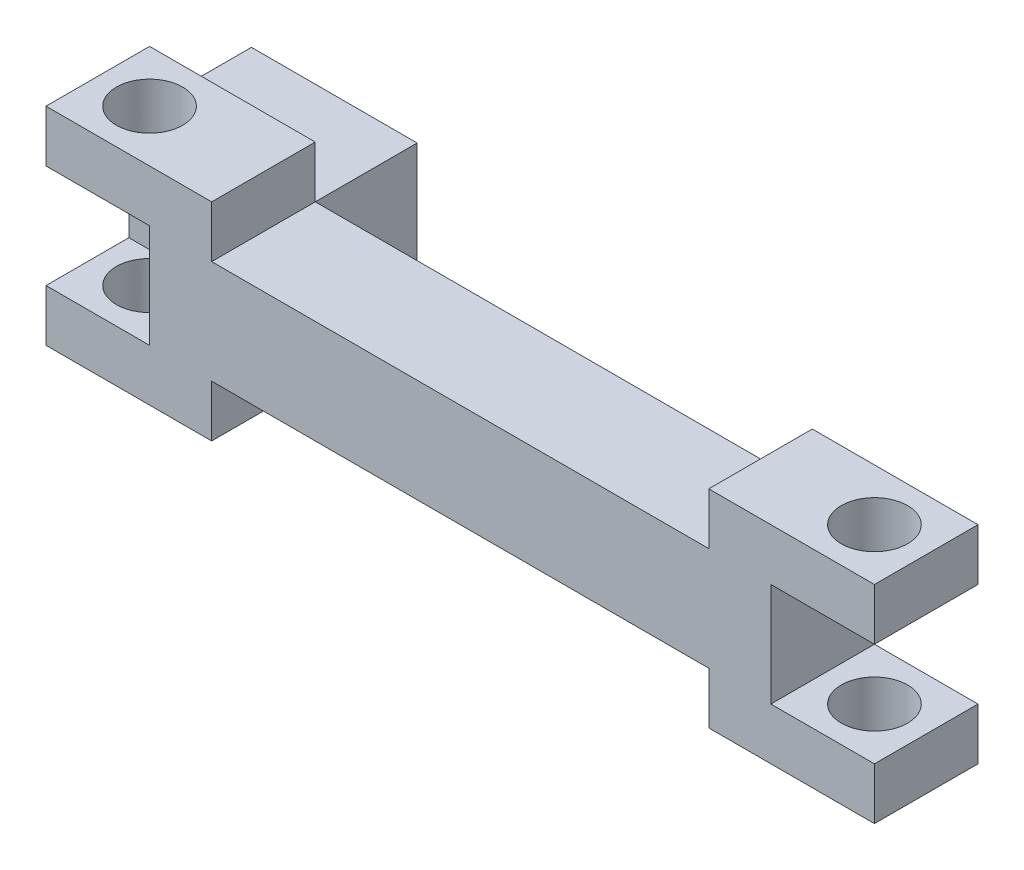
ISO-10303-21;
HEADER;
FILE_DESCRIPTION(('STEP AP214'),'2;1');
FILE_NAME('part.step','',(''),(''),'','','');
FILE_SCHEMA(('AUTOMOTIVE_DESIGN { 1 0 10303 214 1 1 1 1 }'));
ENDSEC;
DATA;
#1=APPLICATION_CONTEXT('core data for automotive mechanical design processes');
#2=APPLICATION_PROTOCOL_DEFINITION('international standard','automotive_design',2000,#1);
#3=PRODUCT_CONTEXT('',#1,'mechanical');
#4=PRODUCT('Part','Part','',(#3));
#5=PRODUCT_RELATED_PRODUCT_CATEGORY('part','',(#4));
#6=PRODUCT_DEFINITION_FORMATION('','',#4);
#7=PRODUCT_DEFINITION_CONTEXT('part definition',#1,'design');
#8=PRODUCT_DEFINITION('design','',#6,#7);
#9=PRODUCT_DEFINITION_SHAPE('','',#8);
#10=(LENGTH_UNIT() NAMED_UNIT(*) SI_UNIT(.MILLI.,.METRE.));
#11=(NAMED_UNIT(*) PLANE_ANGLE_UNIT() SI_UNIT($,.RADIAN.));
#12=(NAMED_UNIT(*) SI_UNIT($,.STERADIAN.) SOLID_ANGLE_UNIT());
#13=UNCERTAINTY_MEASURE_WITH_UNIT(LENGTH_MEASURE(1.E-05),#10,'distance_accuracy_value','');
#14=(GEOMETRIC_REPRESENTATION_CONTEXT(3) GLOBAL_UNCERTAINTY_ASSIGNED_CONTEXT((#13)) GLOBAL_UNIT_ASSIGNED_CONTEXT((#10,
#11,#12)) REPRESENTATION_CONTEXT('',''));
#15=CARTESIAN_POINT('',(0.,0.,0.));
#16=DIRECTION('',(0.,0.,1.));
#17=DIRECTION('',(1.,0.,0.));
#18=AXIS2_PLACEMENT_3D('',#15,#16,#17);
#19=CARTESIAN_POINT('',(-88.3,-13.,12.5));
#20=DIRECTION('',(0.,1.,0.));
#21=DIRECTION('',(-1.,0.,0.));
#22=AXIS2_PLACEMENT_3D('',#19,#20,#21);
#23=CYLINDRICAL_SURFACE('',#22,8.00000000000001);
#24=CARTESIAN_POINT('',(-88.3,7.5,12.5));
#25=DIRECTION('',(0.,1.,0.));
#26=DIRECTION('',(0.,0.,1.));
#27=AXIS2_PLACEMENT_3D('',#24,#25,#26);
#28=CIRCLE('',#27,8.00000000000001);
#29=CARTESIAN_POINT('',(-88.3,7.5,20.5));
#30=VERTEX_POINT('',#29);
#31=EDGE_CURVE('E292',#30,#30,#28,.T.);
#32=ORIENTED_EDGE('',*,*,#31,.F.);
#33=EDGE_LOOP('',(#32));
#34=FACE_BOUND('',#33,.T.);
#35=CARTESIAN_POINT('',(-88.3,57.5,12.5));
#36=DIRECTION('',(0.,1.,0.));
#37=DIRECTION('',(-1.,0.,0.));
#38=AXIS2_PLACEMENT_3D('',#35,#36,#37);
#39=CIRCLE('',#38,8.00000000000001);
#40=CARTESIAN_POINT('',(-96.3,57.5,12.5));
#41=VERTEX_POINT('',#40);
#42=EDGE_CURVE('E289',#41,#41,#39,.T.);
#43=ORIENTED_EDGE('',*,*,#42,.T.);
#44=EDGE_LOOP('',(#43));
#45=FACE_BOUND('',#44,.T.);
#46=DIRECTION('',(0.,1.,0.));
#47=VECTOR('',#46,1.);
#48=CARTESIAN_POINT('',(-85.516117818585,-13.,5.));
#49=LINE('',#48,#47);
#50=CARTESIAN_POINT('',(-85.516117818585,45.,5.));
#51=VERTEX_POINT('',#50);
#52=CARTESIAN_POINT('',(-85.516117818585,20.,5.));
#53=VERTEX_POINT('',#52);
#54=EDGE_CURVE('E11',#51,#53,#49,.F.);
#55=ORIENTED_EDGE('',*,*,#54,.F.);
#56=CARTESIAN_POINT('',(-88.3,45.,12.5));
#57=DIRECTION('',(0.,1.,0.));
#58=DIRECTION('',(-1.,0.,0.));
#59=AXIS2_PLACEMENT_3D('',#56,#57,#58);
#60=CIRCLE('',#59,8.00000000000001);
#61=CARTESIAN_POINT('',(-91.083882181415,45.,5.));
#62=VERTEX_POINT('',#61);
#63=EDGE_CURVE('E217',#51,#62,#60,.F.);
#64=ORIENTED_EDGE('',*,*,#63,.T.);
#65=DIRECTION('',(0.,1.,0.));
#66=VECTOR('',#65,1.);
#67=CARTESIAN_POINT('',(-91.0838821814151,-13.,5.));
#68=LINE('',#67,#66);
#69=CARTESIAN_POINT('',(-91.0838821814151,20.,5.));
#70=VERTEX_POINT('',#69);
#71=EDGE_CURVE('E416',#70,#62,#68,.T.);
#72=ORIENTED_EDGE('',*,*,#71,.F.);
#73=CARTESIAN_POINT('',(-88.3,20.,12.5));
#74=DIRECTION('',(0.,-1.,0.));
#75=DIRECTION('',(1.,0.,0.));
#76=AXIS2_PLACEMENT_3D('',#73,#74,#75);
#77=CIRCLE('',#76,8.00000000000001);
#78=EDGE_CURVE('E47',#70,#53,#77,.F.);
#79=ORIENTED_EDGE('',*,*,#78,.T.);
#80=EDGE_LOOP('',(#55,#64,#72,#79));
#81=FACE_BOUND('',#80,.T.);
#82=ADVANCED_FACE('F39',(#34,#45,#81),#23,.F.);
#83=CARTESIAN_POINT('',(0.,0.,0.));
#84=DIRECTION('',(0.,0.,1.));
#85=DIRECTION('',(1.,0.,0.));
#86=AXIS2_PLACEMENT_3D('',#83,#84,#85);
#87=PLANE('',#86);
#88=DIRECTION('',(1.,0.,0.));
#89=VECTOR('',#88,1.);
#90=CARTESIAN_POINT('',(-60.8,45.,0.));
#91=LINE('',#90,#89);
#92=CARTESIAN_POINT('',(-100.8,45.,0.));
#93=VERTEX_POINT('',#92);
#94=CARTESIAN_POINT('',(-60.8,45.,0.));
#95=VERTEX_POINT('',#94);
#96=EDGE_CURVE('E254',#93,#95,#91,.T.);
#97=ORIENTED_EDGE('',*,*,#96,.F.);
#98=DIRECTION('',(0.,1.,0.));
#99=VECTOR('',#98,1.);
#100=CARTESIAN_POINT('',(-100.8,0.,0.));
#101=LINE('',#100,#99);
#102=CARTESIAN_POINT('',(-100.8,57.5,0.));
#103=VERTEX_POINT('',#102);
#104=EDGE_CURVE('E364',#93,#103,#101,.T.);
#105=ORIENTED_EDGE('',*,*,#104,.T.);
#106=DIRECTION('',(1.,0.,0.));
#107=VECTOR('',#106,1.);
#108=CARTESIAN_POINT('',(0.,57.5,0.));
#109=LINE('',#108,#107);
#110=CARTESIAN_POINT('',(-60.8,57.5,0.));
#111=VERTEX_POINT('',#110);
#112=EDGE_CURVE('E361',#103,#111,#109,.T.);
#113=ORIENTED_EDGE('',*,*,#112,.T.);
#114=DIRECTION('',(0.,1.,0.));
#115=VECTOR('',#114,1.);
#116=CARTESIAN_POINT('',(-60.8,0.,0.));
#117=LINE('',#116,#115);
#118=EDGE_CURVE('E358',#95,#111,#117,.T.);
#119=ORIENTED_EDGE('',*,*,#118,.F.);
#120=EDGE_LOOP('',(#97,#105,#113,#119));
#121=FACE_BOUND('',#120,.T.);
#122=ADVANCED_FACE('F449',(#121),#87,.F.);
#123=DIRECTION('',(0.,-1.,0.));
#124=VECTOR('',#123,1.);
#125=CARTESIAN_POINT('',(-60.8,45.,0.));
#126=LINE('',#125,#124);
#127=CARTESIAN_POINT('',(-60.8,20.,0.));
#128=VERTEX_POINT('',#127);
#129=EDGE_CURVE('E247',#95,#128,#126,.T.);
#130=ORIENTED_EDGE('',*,*,#129,.F.);
#131=DIRECTION('',(1.,0.,0.));
#132=VECTOR('',#131,1.);
#133=CARTESIAN_POINT('',(0.,45.,0.));
#134=LINE('',#133,#132);
#135=CARTESIAN_POINT('',(59.2,45.,0.));
#136=VERTEX_POINT('',#135);
#137=EDGE_CURVE('E355',#95,#136,#134,.T.);
#138=ORIENTED_EDGE('',*,*,#137,.T.);
#139=DIRECTION('',(0.,-1.,0.));
#140=VECTOR('',#139,1.);
#141=CARTESIAN_POINT('',(59.2,0.,0.));
#142=LINE('',#141,#140);
#143=CARTESIAN_POINT('',(59.2,57.5,0.));
#144=VERTEX_POINT('',#143);
#145=EDGE_CURVE('E352',#144,#136,#142,.T.);
#146=ORIENTED_EDGE('',*,*,#145,.F.);
#147=DIRECTION('',(1.,0.,0.));
#148=VECTOR('',#147,1.);
#149=CARTESIAN_POINT('',(0.,57.5,0.));
#150=LINE('',#149,#148);
#151=CARTESIAN_POINT('',(99.2,57.5,0.));
#152=VERTEX_POINT('',#151);
#153=EDGE_CURVE('E349',#144,#152,#150,.T.);
#154=ORIENTED_EDGE('',*,*,#153,.T.);
#155=DIRECTION('',(0.,-1.,0.));
#156=VECTOR('',#155,1.);
#157=CARTESIAN_POINT('',(99.2,0.,0.));
#158=LINE('',#157,#156);
#159=CARTESIAN_POINT('',(99.2,45.,0.));
#160=VERTEX_POINT('',#159);
#161=EDGE_CURVE('E346',#152,#160,#158,.T.);
#162=ORIENTED_EDGE('',*,*,#161,.T.);
#163=DIRECTION('',(1.,0.,0.));
#164=VECTOR('',#163,1.);
#165=CARTESIAN_POINT('',(0.,45.,0.));
#166=LINE('',#165,#164);
#167=CARTESIAN_POINT('',(74.2,45.,0.));
#168=VERTEX_POINT('',#167);
#169=EDGE_CURVE('E343',#168,#160,#166,.T.);
#170=ORIENTED_EDGE('',*,*,#169,.F.);
#171=DIRECTION('',(0.,1.,0.));
#172=VECTOR('',#171,1.);
#173=CARTESIAN_POINT('',(74.2,0.,0.));
#174=LINE('',#173,#172);
#175=CARTESIAN_POINT('',(74.2,20.,0.));
#176=VERTEX_POINT('',#175);
#177=EDGE_CURVE('E341',#176,#168,#174,.T.);
#178=ORIENTED_EDGE('',*,*,#177,.F.);
#179=DIRECTION('',(1.,0.,0.));
#180=VECTOR('',#179,1.);
#181=CARTESIAN_POINT('',(0.,20.,0.));
#182=LINE('',#181,#180);
#183=CARTESIAN_POINT('',(99.2,20.,0.));
#184=VERTEX_POINT('',#183);
#185=EDGE_CURVE('E338',#176,#184,#182,.T.);
#186=ORIENTED_EDGE('',*,*,#185,.T.);
#187=DIRECTION('',(0.,-1.,0.));
#188=VECTOR('',#187,1.);
#189=CARTESIAN_POINT('',(99.2,0.,0.));
#190=LINE('',#189,#188);
#191=CARTESIAN_POINT('',(99.2,7.5,0.));
#192=VERTEX_POINT('',#191);
#193=EDGE_CURVE('E335',#184,#192,#190,.T.);
#194=ORIENTED_EDGE('',*,*,#193,.T.);
#195=DIRECTION('',(1.,0.,0.));
#196=VECTOR('',#195,1.);
#197=CARTESIAN_POINT('',(0.,7.5,0.));
#198=LINE('',#197,#196);
#199=CARTESIAN_POINT('',(59.2,7.5,0.));
#200=VERTEX_POINT('',#199);
#201=EDGE_CURVE('E297',#200,#192,#198,.T.);
#202=ORIENTED_EDGE('',*,*,#201,.F.);
#203=DIRECTION('',(0.,-1.,0.));
#204=VECTOR('',#203,1.);
#205=CARTESIAN_POINT('',(59.2,0.,0.));
#206=LINE('',#205,#204);
#207=CARTESIAN_POINT('',(59.2,20.,0.));
#208=VERTEX_POINT('',#207);
#209=EDGE_CURVE('E374',#208,#200,#206,.T.);
#210=ORIENTED_EDGE('',*,*,#209,.F.);
#211=DIRECTION('',(1.,0.,0.));
#212=VECTOR('',#211,1.);
#213=CARTESIAN_POINT('',(0.,20.,0.));
#214=LINE('',#213,#212);
#215=EDGE_CURVE('E372',#128,#208,#214,.T.);
#216=ORIENTED_EDGE('',*,*,#215,.F.);
#217=EDGE_LOOP('',(#130,#138,#146,#154,#162,#170,#178,#186,#194,#202,#210,#216));
#218=FACE_BOUND('',#217,.T.);
#219=ADVANCED_FACE('F455',(#218),#87,.F.);
#220=DIRECTION('',(-1.,0.,0.));
#221=VECTOR('',#220,1.);
#222=CARTESIAN_POINT('',(-60.8,20.,0.));
#223=LINE('',#222,#221);
#224=CARTESIAN_POINT('',(-100.8,20.,0.));
#225=VERTEX_POINT('',#224);
#226=EDGE_CURVE('E263',#128,#225,#223,.T.);
#227=ORIENTED_EDGE('',*,*,#226,.F.);
#228=DIRECTION('',(0.,1.,0.));
#229=VECTOR('',#228,1.);
#230=CARTESIAN_POINT('',(-60.8,0.,0.));
#231=LINE('',#230,#229);
#232=CARTESIAN_POINT('',(-60.8,7.5,0.));
#233=VERTEX_POINT('',#232);
#234=EDGE_CURVE('E369',#233,#128,#231,.T.);
#235=ORIENTED_EDGE('',*,*,#234,.F.);
#236=DIRECTION('',(1.,0.,0.));
#237=VECTOR('',#236,1.);
#238=CARTESIAN_POINT('',(0.,7.5,0.));
#239=LINE('',#238,#237);
#240=CARTESIAN_POINT('',(-100.8,7.5,0.));
#241=VERTEX_POINT('',#240);
#242=EDGE_CURVE('E367',#241,#233,#239,.T.);
#243=ORIENTED_EDGE('',*,*,#242,.F.);
#244=EDGE_CURVE('E365',#241,#225,#101,.T.);
#245=ORIENTED_EDGE('',*,*,#244,.T.);
#246=EDGE_LOOP('',(#227,#235,#243,#245));
#247=FACE_BOUND('',#246,.T.);
#248=ADVANCED_FACE('F458',(#247),#87,.F.);
#249=CARTESIAN_POINT('',(99.2,0.,25.));
#250=DIRECTION('',(1.,0.,0.));
#251=DIRECTION('',(0.,0.,-1.));
#252=AXIS2_PLACEMENT_3D('',#249,#250,#251);
#253=PLANE('',#252);
#254=ORIENTED_EDGE('',*,*,#193,.F.);
#255=DIRECTION('',(0.,0.,-1.));
#256=VECTOR('',#255,1.);
#257=CARTESIAN_POINT('',(99.2,20.,25.));
#258=LINE('',#257,#256);
#259=CARTESIAN_POINT('',(99.2,20.,25.));
#260=VERTEX_POINT('',#259);
#261=EDGE_CURVE('E414',#260,#184,#258,.T.);
#262=ORIENTED_EDGE('',*,*,#261,.F.);
#263=DIRECTION('',(0.,-1.,0.));
#264=VECTOR('',#263,1.);
#265=CARTESIAN_POINT('',(99.2,0.,25.));
#266=LINE('',#265,#264);
#267=CARTESIAN_POINT('',(99.2,7.5,25.));
#268=VERTEX_POINT('',#267);
#269=EDGE_CURVE('E293',#260,#268,#266,.T.);
#270=ORIENTED_EDGE('',*,*,#269,.T.);
#271=DIRECTION('',(0.,0.,-1.));
#272=VECTOR('',#271,1.);
#273=CARTESIAN_POINT('',(99.2,7.5,25.));
#274=LINE('',#273,#272);
#275=EDGE_CURVE('E334',#268,#192,#274,.T.);
#276=ORIENTED_EDGE('',*,*,#275,.T.);
#277=EDGE_LOOP('',(#254,#262,#270,#276));
#278=FACE_BOUND('',#277,.T.);
#279=ADVANCED_FACE('F41',(#278),#253,.T.);
#280=CARTESIAN_POINT('',(0.,20.,25.));
#281=DIRECTION('',(0.,1.,0.));
#282=DIRECTION('',(0.,0.,1.));
#283=AXIS2_PLACEMENT_3D('',#280,#281,#282);
#284=PLANE('',#283);
#285=CARTESIAN_POINT('',(86.7,20.,12.5));
#286=DIRECTION('',(0.,1.,0.));
#287=DIRECTION('',(0.,0.,1.));
#288=AXIS2_PLACEMENT_3D('',#285,#286,#287);
#289=CIRCLE('',#288,8.00000000000001);
#290=CARTESIAN_POINT('',(86.7,20.,20.5));
#291=VERTEX_POINT('',#290);
#292=EDGE_CURVE('E286',#291,#291,#289,.T.);
#293=ORIENTED_EDGE('',*,*,#292,.F.);
#294=EDGE_LOOP('',(#293));
#295=FACE_BOUND('',#294,.T.);
#296=ORIENTED_EDGE('',*,*,#185,.F.);
#297=DIRECTION('',(0.,0.,-1.));
#298=VECTOR('',#297,1.);
#299=CARTESIAN_POINT('',(74.2,20.,25.));
#300=LINE('',#299,#298);
#301=CARTESIAN_POINT('',(74.2,20.,25.));
#302=VERTEX_POINT('',#301);
#303=EDGE_CURVE('E412',#302,#176,#300,.T.);
#304=ORIENTED_EDGE('',*,*,#303,.F.);
#305=DIRECTION('',(1.,0.,0.));
#306=VECTOR('',#305,1.);
#307=CARTESIAN_POINT('',(0.,20.,25.));
#308=LINE('',#307,#306);
#309=EDGE_CURVE('E296',#302,#260,#308,.T.);
#310=ORIENTED_EDGE('',*,*,#309,.T.);
#311=ORIENTED_EDGE('',*,*,#261,.T.);
#312=EDGE_LOOP('',(#296,#304,#310,#311));
#313=FACE_BOUND('',#312,.T.);
#314=ADVANCED_FACE('F520',(#295,#313),#284,.T.);
#315=CARTESIAN_POINT('',(74.2,0.,25.));
#316=DIRECTION('',(-1.,0.,0.));
#317=DIRECTION('',(0.,0.,1.));
#318=AXIS2_PLACEMENT_3D('',#315,#316,#317);
#319=PLANE('',#318);
#320=ORIENTED_EDGE('',*,*,#177,.T.);
#321=DIRECTION('',(0.,0.,-1.));
#322=VECTOR('',#321,1.);
#323=CARTESIAN_POINT('',(74.2,45.,25.));
#324=LINE('',#323,#322);
#325=CARTESIAN_POINT('',(74.2,45.,25.));
#326=VERTEX_POINT('',#325);
#327=EDGE_CURVE('E409',#326,#168,#324,.T.);
#328=ORIENTED_EDGE('',*,*,#327,.F.);
#329=DIRECTION('',(0.,1.,0.));
#330=VECTOR('',#329,1.);
#331=CARTESIAN_POINT('',(74.2,0.,25.));
#332=LINE('',#331,#330);
#333=EDGE_CURVE('E300',#302,#326,#332,.T.);
#334=ORIENTED_EDGE('',*,*,#333,.F.);
#335=ORIENTED_EDGE('',*,*,#303,.T.);
#336=EDGE_LOOP('',(#320,#328,#334,#335));
#337=FACE_BOUND('',#336,.T.);
#338=ADVANCED_FACE('F517',(#337),#319,.F.);
#339=CARTESIAN_POINT('',(0.,45.,25.));
#340=DIRECTION('',(0.,1.,0.));
#341=DIRECTION('',(0.,0.,1.));
#342=AXIS2_PLACEMENT_3D('',#339,#340,#341);
#343=PLANE('',#342);
#344=CARTESIAN_POINT('',(86.7,45.,12.5));
#345=DIRECTION('',(0.,1.,0.));
#346=DIRECTION('',(0.,0.,1.));
#347=AXIS2_PLACEMENT_3D('',#344,#345,#346);
#348=CIRCLE('',#347,8.00000000000001);
#349=CARTESIAN_POINT('',(86.7,45.,20.5));
#350=VERTEX_POINT('',#349);
#351=EDGE_CURVE('E283',#350,#350,#348,.T.);
#352=ORIENTED_EDGE('',*,*,#351,.T.);
#353=EDGE_LOOP('',(#352));
#354=FACE_BOUND('',#353,.T.);
#355=ORIENTED_EDGE('',*,*,#169,.T.);
#356=DIRECTION('',(0.,0.,-1.));
#357=VECTOR('',#356,1.);
#358=CARTESIAN_POINT('',(99.2,45.,25.));
#359=LINE('',#358,#357);
#360=CARTESIAN_POINT('',(99.2,45.,25.));
#361=VERTEX_POINT('',#360);
#362=EDGE_CURVE('E407',#361,#160,#359,.T.);
#363=ORIENTED_EDGE('',*,*,#362,.F.);
#364=DIRECTION('',(1.,0.,0.));
#365=VECTOR('',#364,1.);
#366=CARTESIAN_POINT('',(0.,45.,25.));
#367=LINE('',#366,#365);
#368=EDGE_CURVE('E302',#326,#361,#367,.T.);
#369=ORIENTED_EDGE('',*,*,#368,.F.);
#370=ORIENTED_EDGE('',*,*,#327,.T.);
#371=EDGE_LOOP('',(#355,#363,#369,#370));
#372=FACE_BOUND('',#371,.T.);
#373=ADVANCED_FACE('F513',(#354,#372),#343,.F.);
#374=CARTESIAN_POINT('',(99.2,0.,25.));
#375=DIRECTION('',(1.,0.,0.));
#376=DIRECTION('',(0.,0.,-1.));
#377=AXIS2_PLACEMENT_3D('',#374,#375,#376);
#378=PLANE('',#377);
#379=ORIENTED_EDGE('',*,*,#161,.F.);
#380=DIRECTION('',(0.,0.,-1.));
#381=VECTOR('',#380,1.);
#382=CARTESIAN_POINT('',(99.2,57.5,25.));
#383=LINE('',#382,#381);
#384=CARTESIAN_POINT('',(99.2,57.5,25.));
#385=VERTEX_POINT('',#384);
#386=EDGE_CURVE('E405',#385,#152,#383,.T.);
#387=ORIENTED_EDGE('',*,*,#386,.F.);
#388=DIRECTION('',(0.,-1.,0.));
#389=VECTOR('',#388,1.);
#390=CARTESIAN_POINT('',(99.2,0.,25.));
#391=LINE('',#390,#389);
#392=EDGE_CURVE('E304',#385,#361,#391,.T.);
#393=ORIENTED_EDGE('',*,*,#392,.T.);
#394=ORIENTED_EDGE('',*,*,#362,.T.);
#395=EDGE_LOOP('',(#379,#387,#393,#394));
#396=FACE_BOUND('',#395,.T.);
#397=ADVANCED_FACE('F509',(#396),#378,.T.);
#398=CARTESIAN_POINT('',(0.,57.5,25.));
#399=DIRECTION('',(0.,1.,0.));
#400=DIRECTION('',(-1.,0.,0.));
#401=AXIS2_PLACEMENT_3D('',#398,#399,#400);
#402=PLANE('',#401);
#403=CARTESIAN_POINT('',(86.7,57.5,12.5));
#404=DIRECTION('',(0.,1.,0.));
#405=DIRECTION('',(-1.,0.,0.));
#406=AXIS2_PLACEMENT_3D('',#403,#404,#405);
#407=CIRCLE('',#406,8.00000000000001);
#408=CARTESIAN_POINT('',(78.7,57.5,12.5));
#409=VERTEX_POINT('',#408);
#410=EDGE_CURVE('E279',#409,#409,#407,.T.);
#411=ORIENTED_EDGE('',*,*,#410,.F.);
#412=EDGE_LOOP('',(#411));
#413=FACE_BOUND('',#412,.T.);
#414=ORIENTED_EDGE('',*,*,#153,.F.);
#415=DIRECTION('',(0.,0.,-1.));
#416=VECTOR('',#415,1.);
#417=CARTESIAN_POINT('',(59.2,57.5,25.));
#418=LINE('',#417,#416);
#419=CARTESIAN_POINT('',(59.2,57.5,25.));
#420=VERTEX_POINT('',#419);
#421=EDGE_CURVE('E403',#420,#144,#418,.T.);
#422=ORIENTED_EDGE('',*,*,#421,.F.);
#423=DIRECTION('',(1.,0.,0.));
#424=VECTOR('',#423,1.);
#425=CARTESIAN_POINT('',(0.,57.5,25.));
#426=LINE('',#425,#424);
#427=EDGE_CURVE('E307',#420,#385,#426,.T.);
#428=ORIENTED_EDGE('',*,*,#427,.T.);
#429=ORIENTED_EDGE('',*,*,#386,.T.);
#430=EDGE_LOOP('',(#414,#422,#428,#429));
#431=FACE_BOUND('',#430,.T.);
#432=ADVANCED_FACE('F505',(#413,#431),#402,.T.);
#433=CARTESIAN_POINT('',(59.2,0.,25.));
#434=DIRECTION('',(1.,0.,0.));
#435=DIRECTION('',(0.,0.,-1.));
#436=AXIS2_PLACEMENT_3D('',#433,#434,#435);
#437=PLANE('',#436);
#438=ORIENTED_EDGE('',*,*,#145,.T.);
#439=DIRECTION('',(0.,0.,-1.));
#440=VECTOR('',#439,1.);
#441=CARTESIAN_POINT('',(59.2,45.,25.));
#442=LINE('',#441,#440);
#443=CARTESIAN_POINT('',(59.2,45.,25.));
#444=VERTEX_POINT('',#443);
#445=EDGE_CURVE('E401',#444,#136,#442,.T.);
#446=ORIENTED_EDGE('',*,*,#445,.F.);
#447=DIRECTION('',(0.,-1.,0.));
#448=VECTOR('',#447,1.);
#449=CARTESIAN_POINT('',(59.2,0.,25.));
#450=LINE('',#449,#448);
#451=EDGE_CURVE('E310',#420,#444,#450,.T.);
#452=ORIENTED_EDGE('',*,*,#451,.F.);
#453=ORIENTED_EDGE('',*,*,#421,.T.);
#454=EDGE_LOOP('',(#438,#446,#452,#453));
#455=FACE_BOUND('',#454,.T.);
#456=ADVANCED_FACE('F501',(#455),#437,.F.);
#457=CARTESIAN_POINT('',(0.,45.,25.));
#458=DIRECTION('',(0.,1.,0.));
#459=DIRECTION('',(0.,0.,1.));
#460=AXIS2_PLACEMENT_3D('',#457,#458,#459);
#461=PLANE('',#460);
#462=ORIENTED_EDGE('',*,*,#137,.F.);
#463=DIRECTION('',(0.,0.,-1.));
#464=VECTOR('',#463,1.);
#465=CARTESIAN_POINT('',(-60.8,45.,25.));
#466=LINE('',#465,#464);
#467=CARTESIAN_POINT('',(-60.8,45.,25.));
#468=VERTEX_POINT('',#467);
#469=EDGE_CURVE('E398',#468,#95,#466,.T.);
#470=ORIENTED_EDGE('',*,*,#469,.F.);
#471=DIRECTION('',(1.,0.,0.));
#472=VECTOR('',#471,1.);
#473=CARTESIAN_POINT('',(0.,45.,25.));
#474=LINE('',#473,#472);
#475=EDGE_CURVE('E312',#468,#444,#474,.T.);
#476=ORIENTED_EDGE('',*,*,#475,.T.);
#477=ORIENTED_EDGE('',*,*,#445,.T.);
#478=EDGE_LOOP('',(#462,#470,#476,#477));
#479=FACE_BOUND('',#478,.T.);
#480=ADVANCED_FACE('F497',(#479),#461,.T.);
#481=CARTESIAN_POINT('',(-60.8,0.,25.));
#482=DIRECTION('',(-1.,0.,0.));
#483=DIRECTION('',(0.,0.,1.));
#484=AXIS2_PLACEMENT_3D('',#481,#482,#483);
#485=PLANE('',#484);
#486=ORIENTED_EDGE('',*,*,#118,.T.);
#487=DIRECTION('',(0.,0.,-1.));
#488=VECTOR('',#487,1.);
#489=CARTESIAN_POINT('',(-60.8,57.5,25.));
#490=LINE('',#489,#488);
#491=CARTESIAN_POINT('',(-60.8,57.5,25.));
#492=VERTEX_POINT('',#491);
#493=EDGE_CURVE('E396',#492,#111,#490,.T.);
#494=ORIENTED_EDGE('',*,*,#493,.F.);
#495=DIRECTION('',(0.,1.,0.));
#496=VECTOR('',#495,1.);
#497=CARTESIAN_POINT('',(-60.8,0.,25.));
#498=LINE('',#497,#496);
#499=EDGE_CURVE('E315',#468,#492,#498,.T.);
#500=ORIENTED_EDGE('',*,*,#499,.F.);
#501=ORIENTED_EDGE('',*,*,#469,.T.);
#502=EDGE_LOOP('',(#486,#494,#500,#501));
#503=FACE_BOUND('',#502,.T.);
#504=ADVANCED_FACE('F493',(#503),#485,.F.);
#505=CARTESIAN_POINT('',(0.,57.5,25.));
#506=DIRECTION('',(0.,1.,0.));
#507=DIRECTION('',(-1.,0.,0.));
#508=AXIS2_PLACEMENT_3D('',#505,#506,#507);
#509=PLANE('',#508);
#510=ORIENTED_EDGE('',*,*,#42,.F.);
#511=EDGE_LOOP('',(#510));
#512=FACE_BOUND('',#511,.T.);
#513=ORIENTED_EDGE('',*,*,#112,.F.);
#514=DIRECTION('',(0.,0.,-1.));
#515=VECTOR('',#514,1.);
#516=CARTESIAN_POINT('',(-100.8,57.5,25.));
#517=LINE('',#516,#515);
#518=CARTESIAN_POINT('',(-100.8,57.5,25.));
#519=VERTEX_POINT('',#518);
#520=EDGE_CURVE('E393',#519,#103,#517,.T.);
#521=ORIENTED_EDGE('',*,*,#520,.F.);
#522=DIRECTION('',(1.,0.,0.));
#523=VECTOR('',#522,1.);
#524=CARTESIAN_POINT('',(0.,57.5,25.));
#525=LINE('',#524,#523);
#526=EDGE_CURVE('E317',#519,#492,#525,.T.);
#527=ORIENTED_EDGE('',*,*,#526,.T.);
#528=ORIENTED_EDGE('',*,*,#493,.T.);
#529=EDGE_LOOP('',(#513,#521,#527,#528));
#530=FACE_BOUND('',#529,.T.);
#531=ADVANCED_FACE('F490',(#512,#530),#509,.T.);
#532=CARTESIAN_POINT('',(-100.8,0.,25.));
#533=DIRECTION('',(-1.,0.,0.));
#534=DIRECTION('',(0.,0.,1.));
#535=AXIS2_PLACEMENT_3D('',#532,#533,#534);
#536=PLANE('',#535);
#537=DIRECTION('',(0.,0.,1.));
#538=VECTOR('',#537,1.);
#539=CARTESIAN_POINT('',(-100.8,20.,5.));
#540=LINE('',#539,#538);
#541=CARTESIAN_POINT('',(-100.8,20.,5.));
#542=VERTEX_POINT('',#541);
#543=CARTESIAN_POINT('',(-100.8,20.,25.));
#544=VERTEX_POINT('',#543);
#545=EDGE_CURVE('E240',#542,#544,#540,.T.);
#546=ORIENTED_EDGE('',*,*,#545,.F.);
#547=DIRECTION('',(0.,-1.,0.));
#548=VECTOR('',#547,1.);
#549=CARTESIAN_POINT('',(-100.8,20.,5.));
#550=LINE('',#549,#548);
#551=CARTESIAN_POINT('',(-100.8,45.,5.));
#552=VERTEX_POINT('',#551);
#553=EDGE_CURVE('E220',#552,#542,#550,.T.);
#554=ORIENTED_EDGE('',*,*,#553,.F.);
#555=DIRECTION('',(0.,0.,1.));
#556=VECTOR('',#555,1.);
#557=CARTESIAN_POINT('',(-100.8,45.,5.));
#558=LINE('',#557,#556);
#559=CARTESIAN_POINT('',(-100.8,45.,25.));
#560=VERTEX_POINT('',#559);
#561=EDGE_CURVE('E210',#552,#560,#558,.T.);
#562=ORIENTED_EDGE('',*,*,#561,.T.);
#563=DIRECTION('',(0.,1.,0.));
#564=VECTOR('',#563,1.);
#565=CARTESIAN_POINT('',(-100.8,0.,25.));
#566=LINE('',#565,#564);
#567=EDGE_CURVE('E320',#560,#519,#566,.T.);
#568=ORIENTED_EDGE('',*,*,#567,.T.);
#569=ORIENTED_EDGE('',*,*,#520,.T.);
#570=ORIENTED_EDGE('',*,*,#104,.F.);
#571=DIRECTION('',(0.,0.,1.));
#572=VECTOR('',#571,1.);
#573=CARTESIAN_POINT('',(-100.8,45.,-24.6));
#574=LINE('',#573,#572);
#575=CARTESIAN_POINT('',(-100.8,45.,-24.6));
#576=VERTEX_POINT('',#575);
#577=EDGE_CURVE('E270',#576,#93,#574,.T.);
#578=ORIENTED_EDGE('',*,*,#577,.F.);
#579=DIRECTION('',(0.,1.,0.));
#580=VECTOR('',#579,1.);
#581=CARTESIAN_POINT('',(-100.8,45.,-24.6));
#582=LINE('',#581,#580);
#583=CARTESIAN_POINT('',(-100.8,20.,-24.6));
#584=VERTEX_POINT('',#583);
#585=EDGE_CURVE('E256',#584,#576,#582,.T.);
#586=ORIENTED_EDGE('',*,*,#585,.F.);
#587=DIRECTION('',(0.,0.,1.));
#588=VECTOR('',#587,1.);
#589=CARTESIAN_POINT('',(-100.8,20.,-24.6));
#590=LINE('',#589,#588);
#591=EDGE_CURVE('E273',#584,#225,#590,.T.);
#592=ORIENTED_EDGE('',*,*,#591,.T.);
#593=ORIENTED_EDGE('',*,*,#244,.F.);
#594=DIRECTION('',(0.,0.,-1.));
#595=VECTOR('',#594,1.);
#596=CARTESIAN_POINT('',(-100.8,7.5,25.));
#597=LINE('',#596,#595);
#598=CARTESIAN_POINT('',(-100.8,7.5,25.));
#599=VERTEX_POINT('',#598);
#600=EDGE_CURVE('E391',#599,#241,#597,.T.);
#601=ORIENTED_EDGE('',*,*,#600,.F.);
#602=EDGE_CURVE('E321',#599,#544,#566,.T.);
#603=ORIENTED_EDGE('',*,*,#602,.T.);
#604=EDGE_LOOP('',(#546,#554,#562,#568,#569,#570,#578,#586,#592,#593,#601,#603));
#605=FACE_BOUND('',#604,.T.);
#606=ADVANCED_FACE('F437',(#605),#536,.T.);
#607=CARTESIAN_POINT('',(0.,7.5,25.));
#608=DIRECTION('',(0.,1.,0.));
#609=DIRECTION('',(0.,0.,1.));
#610=AXIS2_PLACEMENT_3D('',#607,#608,#609);
#611=PLANE('',#610);
#612=ORIENTED_EDGE('',*,*,#31,.T.);
#613=EDGE_LOOP('',(#612));
#614=FACE_BOUND('',#613,.T.);
#615=ORIENTED_EDGE('',*,*,#242,.T.);
#616=DIRECTION('',(0.,0.,-1.));
#617=VECTOR('',#616,1.);
#618=CARTESIAN_POINT('',(-60.8,7.5,25.));
#619=LINE('',#618,#617);
#620=CARTESIAN_POINT('',(-60.8,7.5,25.));
#621=VERTEX_POINT('',#620);
#622=EDGE_CURVE('E388',#621,#233,#619,.T.);
#623=ORIENTED_EDGE('',*,*,#622,.F.);
#624=DIRECTION('',(1.,0.,0.));
#625=VECTOR('',#624,1.);
#626=CARTESIAN_POINT('',(0.,7.5,25.));
#627=LINE('',#626,#625);
#628=EDGE_CURVE('E324',#599,#621,#627,.T.);
#629=ORIENTED_EDGE('',*,*,#628,.F.);
#630=ORIENTED_EDGE('',*,*,#600,.T.);
#631=EDGE_LOOP('',(#615,#623,#629,#630));
#632=FACE_BOUND('',#631,.T.);
#633=ADVANCED_FACE('F483',(#614,#632),#611,.F.);
#634=CARTESIAN_POINT('',(-60.8,0.,25.));
#635=DIRECTION('',(-1.,0.,0.));
#636=DIRECTION('',(0.,0.,1.));
#637=AXIS2_PLACEMENT_3D('',#634,#635,#636);
#638=PLANE('',#637);
#639=ORIENTED_EDGE('',*,*,#234,.T.);
#640=DIRECTION('',(0.,0.,-1.));
#641=VECTOR('',#640,1.);
#642=CARTESIAN_POINT('',(-60.8,20.,25.));
#643=LINE('',#642,#641);
#644=CARTESIAN_POINT('',(-60.8,20.,25.));
#645=VERTEX_POINT('',#644);
#646=EDGE_CURVE('E385',#645,#128,#643,.T.);
#647=ORIENTED_EDGE('',*,*,#646,.F.);
#648=DIRECTION('',(0.,1.,0.));
#649=VECTOR('',#648,1.);
#650=CARTESIAN_POINT('',(-60.8,0.,25.));
#651=LINE('',#650,#649);
#652=EDGE_CURVE('E326',#621,#645,#651,.T.);
#653=ORIENTED_EDGE('',*,*,#652,.F.);
#654=ORIENTED_EDGE('',*,*,#622,.T.);
#655=EDGE_LOOP('',(#639,#647,#653,#654));
#656=FACE_BOUND('',#655,.T.);
#657=ADVANCED_FACE('F479',(#656),#638,.F.);
#658=CARTESIAN_POINT('',(0.,20.,25.));
#659=DIRECTION('',(0.,1.,0.));
#660=DIRECTION('',(0.,0.,1.));
#661=AXIS2_PLACEMENT_3D('',#658,#659,#660);
#662=PLANE('',#661);
#663=ORIENTED_EDGE('',*,*,#215,.T.);
#664=DIRECTION('',(0.,0.,-1.));
#665=VECTOR('',#664,1.);
#666=CARTESIAN_POINT('',(59.2,20.,25.));
#667=LINE('',#666,#665);
#668=CARTESIAN_POINT('',(59.2,20.,25.));
#669=VERTEX_POINT('',#668);
#670=EDGE_CURVE('E382',#669,#208,#667,.T.);
#671=ORIENTED_EDGE('',*,*,#670,.F.);
#672=DIRECTION('',(1.,0.,0.));
#673=VECTOR('',#672,1.);
#674=CARTESIAN_POINT('',(0.,20.,25.));
#675=LINE('',#674,#673);
#676=EDGE_CURVE('E328',#645,#669,#675,.T.);
#677=ORIENTED_EDGE('',*,*,#676,.F.);
#678=ORIENTED_EDGE('',*,*,#646,.T.);
#679=EDGE_LOOP('',(#663,#671,#677,#678));
#680=FACE_BOUND('',#679,.T.);
#681=ADVANCED_FACE('F475',(#680),#662,.F.);
#682=CARTESIAN_POINT('',(59.2,0.,25.));
#683=DIRECTION('',(1.,0.,0.));
#684=DIRECTION('',(0.,0.,-1.));
#685=AXIS2_PLACEMENT_3D('',#682,#683,#684);
#686=PLANE('',#685);
#687=ORIENTED_EDGE('',*,*,#209,.T.);
#688=DIRECTION('',(0.,0.,-1.));
#689=VECTOR('',#688,1.);
#690=CARTESIAN_POINT('',(59.2,7.5,25.));
#691=LINE('',#690,#689);
#692=CARTESIAN_POINT('',(59.2,7.5,25.));
#693=VERTEX_POINT('',#692);
#694=EDGE_CURVE('E379',#693,#200,#691,.T.);
#695=ORIENTED_EDGE('',*,*,#694,.F.);
#696=DIRECTION('',(0.,-1.,0.));
#697=VECTOR('',#696,1.);
#698=CARTESIAN_POINT('',(59.2,0.,25.));
#699=LINE('',#698,#697);
#700=EDGE_CURVE('E330',#669,#693,#699,.T.);
#701=ORIENTED_EDGE('',*,*,#700,.F.);
#702=ORIENTED_EDGE('',*,*,#670,.T.);
#703=EDGE_LOOP('',(#687,#695,#701,#702));
#704=FACE_BOUND('',#703,.T.);
#705=ADVANCED_FACE('F471',(#704),#686,.F.);
#706=CARTESIAN_POINT('',(0.,7.5,25.));
#707=DIRECTION('',(0.,1.,0.));
#708=DIRECTION('',(0.,0.,1.));
#709=AXIS2_PLACEMENT_3D('',#706,#707,#708);
#710=PLANE('',#709);
#711=CARTESIAN_POINT('',(86.7,7.5,12.5));
#712=DIRECTION('',(0.,1.,0.));
#713=DIRECTION('',(0.,0.,1.));
#714=AXIS2_PLACEMENT_3D('',#711,#712,#713);
#715=CIRCLE('',#714,8.00000000000001);
#716=CARTESIAN_POINT('',(86.7,7.5,20.5));
#717=VERTEX_POINT('',#716);
#718=EDGE_CURVE('E282',#717,#717,#715,.T.);
#719=ORIENTED_EDGE('',*,*,#718,.T.);
#720=EDGE_LOOP('',(#719));
#721=FACE_BOUND('',#720,.T.);
#722=ORIENTED_EDGE('',*,*,#201,.T.);
#723=ORIENTED_EDGE('',*,*,#275,.F.);
#724=DIRECTION('',(1.,0.,0.));
#725=VECTOR('',#724,1.);
#726=CARTESIAN_POINT('',(0.,7.5,25.));
#727=LINE('',#726,#725);
#728=EDGE_CURVE('E332',#693,#268,#727,.T.);
#729=ORIENTED_EDGE('',*,*,#728,.F.);
#730=ORIENTED_EDGE('',*,*,#694,.T.);
#731=EDGE_LOOP('',(#722,#723,#729,#730));
#732=FACE_BOUND('',#731,.T.);
#733=ADVANCED_FACE('F467',(#721,#732),#710,.F.);
#734=CARTESIAN_POINT('',(0.,0.,25.));
#735=DIRECTION('',(0.,0.,1.));
#736=DIRECTION('',(1.,0.,0.));
#737=AXIS2_PLACEMENT_3D('',#734,#735,#736);
#738=PLANE('',#737);
#739=DIRECTION('',(1.,0.,0.));
#740=VECTOR('',#739,1.);
#741=CARTESIAN_POINT('',(-75.8,20.,25.));
#742=LINE('',#741,#740);
#743=CARTESIAN_POINT('',(-75.8,20.,25.));
#744=VERTEX_POINT('',#743);
#745=EDGE_CURVE('E227',#544,#744,#742,.T.);
#746=ORIENTED_EDGE('',*,*,#745,.F.);
#747=ORIENTED_EDGE('',*,*,#602,.F.);
#748=ORIENTED_EDGE('',*,*,#628,.T.);
#749=ORIENTED_EDGE('',*,*,#652,.T.);
#750=ORIENTED_EDGE('',*,*,#676,.T.);
#751=ORIENTED_EDGE('',*,*,#700,.T.);
#752=ORIENTED_EDGE('',*,*,#728,.T.);
#753=ORIENTED_EDGE('',*,*,#269,.F.);
#754=ORIENTED_EDGE('',*,*,#309,.F.);
#755=ORIENTED_EDGE('',*,*,#333,.T.);
#756=ORIENTED_EDGE('',*,*,#368,.T.);
#757=ORIENTED_EDGE('',*,*,#392,.F.);
#758=ORIENTED_EDGE('',*,*,#427,.F.);
#759=ORIENTED_EDGE('',*,*,#451,.T.);
#760=ORIENTED_EDGE('',*,*,#475,.F.);
#761=ORIENTED_EDGE('',*,*,#499,.T.);
#762=ORIENTED_EDGE('',*,*,#526,.F.);
#763=ORIENTED_EDGE('',*,*,#567,.F.);
#764=DIRECTION('',(-1.,0.,0.));
#765=VECTOR('',#764,1.);
#766=CARTESIAN_POINT('',(-75.8,45.,25.));
#767=LINE('',#766,#765);
#768=CARTESIAN_POINT('',(-75.8,45.,25.));
#769=VERTEX_POINT('',#768);
#770=EDGE_CURVE('E230',#769,#560,#767,.T.);
#771=ORIENTED_EDGE('',*,*,#770,.F.);
#772=DIRECTION('',(0.,1.,0.));
#773=VECTOR('',#772,1.);
#774=CARTESIAN_POINT('',(-75.8,20.,25.));
#775=LINE('',#774,#773);
#776=EDGE_CURVE('E54',#744,#769,#775,.T.);
#777=ORIENTED_EDGE('',*,*,#776,.F.);
#778=EDGE_LOOP('',(#746,#747,#748,#749,#750,#751,#752,#753,#754,#755,#756,#757,#758,#759,#760,
#761,#762,#763,#771,#777));
#779=FACE_BOUND('',#778,.T.);
#780=ADVANCED_FACE('F431',(#779),#738,.T.);
#781=CARTESIAN_POINT('',(86.7,-30.5,12.5));
#782=DIRECTION('',(0.,1.,0.));
#783=DIRECTION('',(-1.,0.,0.));
#784=AXIS2_PLACEMENT_3D('',#781,#782,#783);
#785=CYLINDRICAL_SURFACE('',#784,8.00000000000001);
#786=ORIENTED_EDGE('',*,*,#292,.T.);
#787=EDGE_LOOP('',(#786));
#788=FACE_BOUND('',#787,.T.);
#789=ORIENTED_EDGE('',*,*,#718,.F.);
#790=EDGE_LOOP('',(#789));
#791=FACE_BOUND('',#790,.T.);
#792=ADVANCED_FACE('F466',(#788,#791),#785,.F.);
#793=ORIENTED_EDGE('',*,*,#410,.T.);
#794=EDGE_LOOP('',(#793));
#795=FACE_BOUND('',#794,.T.);
#796=ORIENTED_EDGE('',*,*,#351,.F.);
#797=EDGE_LOOP('',(#796));
#798=FACE_BOUND('',#797,.T.);
#799=ADVANCED_FACE('F463',(#795,#798),#785,.F.);
#800=CARTESIAN_POINT('',(-60.8,45.,-24.6));
#801=DIRECTION('',(-1.,0.,0.));
#802=DIRECTION('',(0.,0.,1.));
#803=AXIS2_PLACEMENT_3D('',#800,#801,#802);
#804=PLANE('',#803);
#805=ORIENTED_EDGE('',*,*,#129,.T.);
#806=DIRECTION('',(0.,0.,1.));
#807=VECTOR('',#806,1.);
#808=CARTESIAN_POINT('',(-60.8,20.,-24.6));
#809=LINE('',#808,#807);
#810=CARTESIAN_POINT('',(-60.8,20.,-24.6));
#811=VERTEX_POINT('',#810);
#812=EDGE_CURVE('E276',#811,#128,#809,.T.);
#813=ORIENTED_EDGE('',*,*,#812,.F.);
#814=DIRECTION('',(0.,-1.,0.));
#815=VECTOR('',#814,1.);
#816=CARTESIAN_POINT('',(-60.8,45.,-24.6));
#817=LINE('',#816,#815);
#818=CARTESIAN_POINT('',(-60.8,45.,-24.6));
#819=VERTEX_POINT('',#818);
#820=EDGE_CURVE('E250',#819,#811,#817,.T.);
#821=ORIENTED_EDGE('',*,*,#820,.F.);
#822=DIRECTION('',(0.,0.,1.));
#823=VECTOR('',#822,1.);
#824=CARTESIAN_POINT('',(-60.8,45.,-24.6));
#825=LINE('',#824,#823);
#826=EDGE_CURVE('E260',#819,#95,#825,.T.);
#827=ORIENTED_EDGE('',*,*,#826,.T.);
#828=EDGE_LOOP('',(#805,#813,#821,#827));
#829=FACE_BOUND('',#828,.T.);
#830=ADVANCED_FACE('F574',(#829),#804,.F.);
#831=CARTESIAN_POINT('',(-60.8,20.,-24.6));
#832=DIRECTION('',(0.,1.,0.));
#833=DIRECTION('',(0.,0.,1.));
#834=AXIS2_PLACEMENT_3D('',#831,#832,#833);
#835=PLANE('',#834);
#836=ORIENTED_EDGE('',*,*,#226,.T.);
#837=ORIENTED_EDGE('',*,*,#591,.F.);
#838=DIRECTION('',(-1.,0.,0.));
#839=VECTOR('',#838,1.);
#840=CARTESIAN_POINT('',(-60.8,20.,-24.6));
#841=LINE('',#840,#839);
#842=EDGE_CURVE('E253',#811,#584,#841,.T.);
#843=ORIENTED_EDGE('',*,*,#842,.F.);
#844=ORIENTED_EDGE('',*,*,#812,.T.);
#845=EDGE_LOOP('',(#836,#837,#843,#844));
#846=FACE_BOUND('',#845,.T.);
#847=ADVANCED_FACE('F563',(#846),#835,.F.);
#848=CARTESIAN_POINT('',(-60.8,45.,-24.6));
#849=DIRECTION('',(0.,-1.,0.));
#850=DIRECTION('',(0.,0.,-1.));
#851=AXIS2_PLACEMENT_3D('',#848,#849,#850);
#852=PLANE('',#851);
#853=ORIENTED_EDGE('',*,*,#96,.T.);
#854=ORIENTED_EDGE('',*,*,#826,.F.);
#855=DIRECTION('',(1.,0.,0.));
#856=VECTOR('',#855,1.);
#857=CARTESIAN_POINT('',(-60.8,45.,-24.6));
#858=LINE('',#857,#856);
#859=EDGE_CURVE('E258',#576,#819,#858,.T.);
#860=ORIENTED_EDGE('',*,*,#859,.F.);
#861=ORIENTED_EDGE('',*,*,#577,.T.);
#862=EDGE_LOOP('',(#853,#854,#860,#861));
#863=FACE_BOUND('',#862,.T.);
#864=ADVANCED_FACE('F584',(#863),#852,.F.);
#865=CARTESIAN_POINT('',(0.,0.,-24.6));
#866=DIRECTION('',(0.,0.,-1.));
#867=DIRECTION('',(-1.,0.,0.));
#868=AXIS2_PLACEMENT_3D('',#865,#866,#867);
#869=PLANE('',#868);
#870=CARTESIAN_POINT('',(-85.8,32.5,-24.6));
#871=DIRECTION('',(0.,0.,-1.));
#872=DIRECTION('',(-1.,0.,0.));
#873=AXIS2_PLACEMENT_3D('',#870,#871,#872);
#874=CIRCLE('',#873,7.50000000000001);
#875=CARTESIAN_POINT('',(-93.3,32.5,-24.6));
#876=VERTEX_POINT('',#875);
#877=EDGE_CURVE('E239',#876,#876,#874,.T.);
#878=ORIENTED_EDGE('',*,*,#877,.F.);
#879=EDGE_LOOP('',(#878));
#880=FACE_BOUND('',#879,.T.);
#881=ORIENTED_EDGE('',*,*,#820,.T.);
#882=ORIENTED_EDGE('',*,*,#842,.T.);
#883=ORIENTED_EDGE('',*,*,#585,.T.);
#884=ORIENTED_EDGE('',*,*,#859,.T.);
#885=EDGE_LOOP('',(#881,#882,#883,#884));
#886=FACE_BOUND('',#885,.T.);
#887=ADVANCED_FACE('F570',(#880,#886),#869,.T.);
#888=CARTESIAN_POINT('',(-85.8,32.5,-12.1));
#889=DIRECTION('',(0.,0.,-1.));
#890=DIRECTION('',(-1.,0.,0.));
#891=AXIS2_PLACEMENT_3D('',#888,#889,#890);
#892=CYLINDRICAL_SURFACE('',#891,7.50000000000001);
#893=CARTESIAN_POINT('',(-85.8,32.5,-12.1));
#894=DIRECTION('',(0.,0.,-1.));
#895=DIRECTION('',(-1.,0.,0.));
#896=AXIS2_PLACEMENT_3D('',#893,#894,#895);
#897=CIRCLE('',#896,7.50000000000001);
#898=CARTESIAN_POINT('',(-93.3,32.5,-12.1));
#899=VERTEX_POINT('',#898);
#900=EDGE_CURVE('E244',#899,#899,#897,.T.);
#901=ORIENTED_EDGE('',*,*,#900,.F.);
#902=EDGE_LOOP('',(#901));
#903=FACE_BOUND('',#902,.T.);
#904=ORIENTED_EDGE('',*,*,#877,.T.);
#905=EDGE_LOOP('',(#904));
#906=FACE_BOUND('',#905,.T.);
#907=ADVANCED_FACE('F591',(#903,#906),#892,.F.);
#908=CARTESIAN_POINT('',(-85.8,32.5,-12.1));
#909=DIRECTION('',(0.,0.,-1.));
#910=DIRECTION('',(-1.,0.,0.));
#911=AXIS2_PLACEMENT_3D('',#908,#909,#910);
#912=PLANE('',#911);
#913=ORIENTED_EDGE('',*,*,#900,.T.);
#914=EDGE_LOOP('',(#913));
#915=FACE_BOUND('',#914,.T.);
#916=ADVANCED_FACE('F759',(#915),#912,.T.);
#917=CARTESIAN_POINT('',(-75.8,20.,5.));
#918=DIRECTION('',(0.,-1.,0.));
#919=DIRECTION('',(1.,0.,0.));
#920=AXIS2_PLACEMENT_3D('',#917,#918,#919);
#921=PLANE('',#920);
#922=DIRECTION('',(1.,0.,0.));
#923=VECTOR('',#922,1.);
#924=CARTESIAN_POINT('',(-75.8,20.,5.));
#925=LINE('',#924,#923);
#926=EDGE_CURVE('E62',#542,#70,#925,.T.);
#927=ORIENTED_EDGE('',*,*,#926,.F.);
#928=ORIENTED_EDGE('',*,*,#545,.T.);
#929=ORIENTED_EDGE('',*,*,#745,.T.);
#930=DIRECTION('',(0.,0.,1.));
#931=VECTOR('',#930,1.);
#932=CARTESIAN_POINT('',(-75.8,20.,5.));
#933=LINE('',#932,#931);
#934=CARTESIAN_POINT('',(-75.8,20.,5.));
#935=VERTEX_POINT('',#934);
#936=EDGE_CURVE('E237',#935,#744,#933,.T.);
#937=ORIENTED_EDGE('',*,*,#936,.F.);
#938=EDGE_CURVE('E225',#53,#935,#925,.T.);
#939=ORIENTED_EDGE('',*,*,#938,.F.);
#940=ORIENTED_EDGE('',*,*,#78,.F.);
#941=EDGE_LOOP('',(#927,#928,#929,#937,#939,#940));
#942=FACE_BOUND('',#941,.T.);
#943=ADVANCED_FACE('F426',(#942),#921,.F.);
#944=CARTESIAN_POINT('',(-75.8,45.,5.));
#945=DIRECTION('',(0.,1.,0.));
#946=DIRECTION('',(-1.,0.,0.));
#947=AXIS2_PLACEMENT_3D('',#944,#945,#946);
#948=PLANE('',#947);
#949=DIRECTION('',(-1.,0.,0.));
#950=VECTOR('',#949,1.);
#951=CARTESIAN_POINT('',(-75.8,45.,5.));
#952=LINE('',#951,#950);
#953=CARTESIAN_POINT('',(-75.8,45.,5.));
#954=VERTEX_POINT('',#953);
#955=EDGE_CURVE('E213',#954,#51,#952,.T.);
#956=ORIENTED_EDGE('',*,*,#955,.F.);
#957=DIRECTION('',(0.,0.,1.));
#958=VECTOR('',#957,1.);
#959=CARTESIAN_POINT('',(-75.8,45.,5.));
#960=LINE('',#959,#958);
#961=EDGE_CURVE('E203',#954,#769,#960,.T.);
#962=ORIENTED_EDGE('',*,*,#961,.T.);
#963=ORIENTED_EDGE('',*,*,#770,.T.);
#964=ORIENTED_EDGE('',*,*,#561,.F.);
#965=EDGE_CURVE('E221',#62,#552,#952,.T.);
#966=ORIENTED_EDGE('',*,*,#965,.F.);
#967=ORIENTED_EDGE('',*,*,#63,.F.);
#968=EDGE_LOOP('',(#956,#962,#963,#964,#966,#967));
#969=FACE_BOUND('',#968,.T.);
#970=ADVANCED_FACE('F214',(#969),#948,.F.);
#971=CARTESIAN_POINT('',(0.,0.,5.));
#972=DIRECTION('',(0.,0.,1.));
#973=DIRECTION('',(1.,0.,0.));
#974=AXIS2_PLACEMENT_3D('',#971,#972,#973);
#975=PLANE('',#974);
#976=ORIENTED_EDGE('',*,*,#54,.T.);
#977=ORIENTED_EDGE('',*,*,#938,.T.);
#978=DIRECTION('',(0.,1.,0.));
#979=VECTOR('',#978,1.);
#980=CARTESIAN_POINT('',(-75.8,20.,5.));
#981=LINE('',#980,#979);
#982=EDGE_CURVE('E207',#935,#954,#981,.T.);
#983=ORIENTED_EDGE('',*,*,#982,.T.);
#984=ORIENTED_EDGE('',*,*,#955,.T.);
#985=EDGE_LOOP('',(#976,#977,#983,#984));
#986=FACE_BOUND('',#985,.T.);
#987=ADVANCED_FACE('F223',(#986),#975,.T.);
#988=ORIENTED_EDGE('',*,*,#71,.T.);
#989=ORIENTED_EDGE('',*,*,#965,.T.);
#990=ORIENTED_EDGE('',*,*,#553,.T.);
#991=ORIENTED_EDGE('',*,*,#926,.T.);
#992=EDGE_LOOP('',(#988,#989,#990,#991));
#993=FACE_BOUND('',#992,.T.);
#994=ADVANCED_FACE('F439',(#993),#975,.T.);
#995=CARTESIAN_POINT('',(-75.8,20.,5.));
#996=DIRECTION('',(1.,0.,0.));
#997=DIRECTION('',(0.,0.,-1.));
#998=AXIS2_PLACEMENT_3D('',#995,#996,#997);
#999=PLANE('',#998);
#1000=ORIENTED_EDGE('',*,*,#776,.T.);
#1001=ORIENTED_EDGE('',*,*,#961,.F.);
#1002=ORIENTED_EDGE('',*,*,#982,.F.);
#1003=ORIENTED_EDGE('',*,*,#936,.T.);
#1004=EDGE_LOOP('',(#1000,#1001,#1002,#1003));
#1005=FACE_BOUND('',#1004,.T.);
#1006=ADVANCED_FACE('F205',(#1005),#999,.F.);
#1007=CLOSED_SHELL('',(#82,#122,#219,#248,#279,#314,#338,#373,#397,#432,#456,#480,#504,#531,
#606,#633,#657,#681,#705,#733,#780,#792,#799,#830,#847,#864,#887,#907,#916,#943,#970,#987,#994,#1006));
#1008=MANIFOLD_SOLID_BREP('B2',#1007);
#1009=ADVANCED_BREP_SHAPE_REPRESENTATION('',(#18,#1008),#14);
#1010=SHAPE_DEFINITION_REPRESENTATION(#9,#1009);
ENDSEC;
END-ISO-10303-21;
